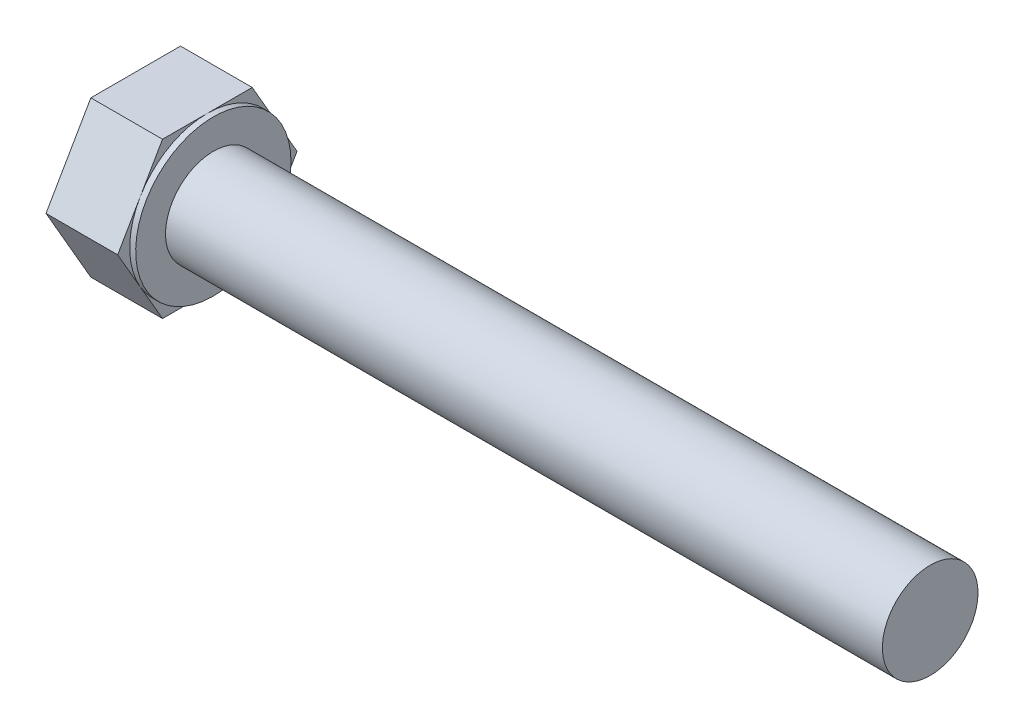
ISO-10303-21;
HEADER;
FILE_DESCRIPTION(('STEP AP214'),'2;1');
FILE_NAME('part.step','',(''),(''),'','','');
FILE_SCHEMA(('AUTOMOTIVE_DESIGN { 1 0 10303 214 1 1 1 1 }'));
ENDSEC;
DATA;
#1=APPLICATION_CONTEXT('core data for automotive mechanical design processes');
#2=APPLICATION_PROTOCOL_DEFINITION('international standard','automotive_design',2000,#1);
#3=PRODUCT_CONTEXT('',#1,'mechanical');
#4=PRODUCT('Part','Part','',(#3));
#5=PRODUCT_RELATED_PRODUCT_CATEGORY('part','',(#4));
#6=PRODUCT_DEFINITION_FORMATION('','',#4);
#7=PRODUCT_DEFINITION_CONTEXT('part definition',#1,'design');
#8=PRODUCT_DEFINITION('design','',#6,#7);
#9=PRODUCT_DEFINITION_SHAPE('','',#8);
#10=(LENGTH_UNIT() NAMED_UNIT(*) SI_UNIT(.MILLI.,.METRE.));
#11=(NAMED_UNIT(*) PLANE_ANGLE_UNIT() SI_UNIT($,.RADIAN.));
#12=(NAMED_UNIT(*) SI_UNIT($,.STERADIAN.) SOLID_ANGLE_UNIT());
#13=UNCERTAINTY_MEASURE_WITH_UNIT(LENGTH_MEASURE(1.E-05),#10,'distance_accuracy_value','');
#14=(GEOMETRIC_REPRESENTATION_CONTEXT(3) GLOBAL_UNCERTAINTY_ASSIGNED_CONTEXT((#13)) GLOBAL_UNIT_ASSIGNED_CONTEXT((#10,
#11,#12)) REPRESENTATION_CONTEXT('',''));
#15=CARTESIAN_POINT('',(0.,0.,0.));
#16=DIRECTION('',(0.,0.,1.));
#17=DIRECTION('',(1.,0.,0.));
#18=AXIS2_PLACEMENT_3D('',#15,#16,#17);
#19=CARTESIAN_POINT('',(0.5,0.,0.));
#20=DIRECTION('',(1.,0.,0.));
#21=DIRECTION('',(0.,0.,-1.));
#22=AXIS2_PLACEMENT_3D('',#19,#20,#21);
#23=PLANE('',#22);
#24=CARTESIAN_POINT('',(0.5,0.,0.));
#25=DIRECTION('',(1.,0.,0.));
#26=DIRECTION('',(0.,0.,-1.));
#27=AXIS2_PLACEMENT_3D('',#24,#25,#26);
#28=CIRCLE('',#27,6.50000000000004);
#29=CARTESIAN_POINT('',(0.5,0.,-6.50000000000004));
#30=VERTEX_POINT('',#29);
#31=EDGE_CURVE('E126',#30,#30,#28,.T.);
#32=ORIENTED_EDGE('',*,*,#31,.T.);
#33=EDGE_LOOP('',(#32));
#34=FACE_BOUND('',#33,.T.);
#35=CARTESIAN_POINT('',(0.5,0.,0.));
#36=DIRECTION('',(1.,0.,0.));
#37=DIRECTION('',(0.,0.,-1.));
#38=AXIS2_PLACEMENT_3D('',#35,#36,#37);
#39=CIRCLE('',#38,4.);
#40=CARTESIAN_POINT('',(0.5,0.,-4.));
#41=VERTEX_POINT('',#40);
#42=EDGE_CURVE('E349',#41,#41,#39,.T.);
#43=ORIENTED_EDGE('',*,*,#42,.F.);
#44=EDGE_LOOP('',(#43));
#45=FACE_BOUND('',#44,.T.);
#46=ADVANCED_FACE('F33',(#34,#45),#23,.T.);
#47=CARTESIAN_POINT('',(0.,0.,0.));
#48=DIRECTION('',(1.,0.,0.));
#49=DIRECTION('',(0.,0.,-1.));
#50=AXIS2_PLACEMENT_3D('',#47,#48,#49);
#51=PLANE('',#50);
#52=CARTESIAN_POINT('',(0.,0.,0.));
#53=DIRECTION('',(1.,0.,0.));
#54=DIRECTION('',(0.,0.,-1.));
#55=AXIS2_PLACEMENT_3D('',#52,#53,#54);
#56=CIRCLE('',#55,6.50000000000004);
#57=CARTESIAN_POINT('',(0.,3.25000000000007,-5.62916512459886));
#58=VERTEX_POINT('',#57);
#59=CARTESIAN_POINT('',(0.,6.5,0.));
#60=VERTEX_POINT('',#59);
#61=EDGE_CURVE('E44',#58,#60,#56,.T.);
#62=ORIENTED_EDGE('',*,*,#61,.F.);
#63=DIRECTION('',(0.,0.866025403784435,0.500000000000007));
#64=VECTOR('',#63,1.);
#65=CARTESIAN_POINT('',(0.,0.,-7.50555349946514));
#66=LINE('',#65,#64);
#67=CARTESIAN_POINT('',(0.,6.50000000000004,-3.75277674973251));
#68=VERTEX_POINT('',#67);
#69=EDGE_CURVE('E111',#58,#68,#66,.T.);
#70=ORIENTED_EDGE('',*,*,#69,.T.);
#71=DIRECTION('',(0.,0.,1.));
#72=VECTOR('',#71,1.);
#73=CARTESIAN_POINT('',(0.,6.50000000000004,-3.75277674973251));
#74=LINE('',#73,#72);
#75=EDGE_CURVE('E124',#68,#60,#74,.T.);
#76=ORIENTED_EDGE('',*,*,#75,.T.);
#77=EDGE_LOOP('',(#62,#70,#76));
#78=FACE_BOUND('',#77,.T.);
#79=ADVANCED_FACE('F123',(#78),#51,.T.);
#80=CARTESIAN_POINT('',(0.,3.24999999999998,5.62916512459889));
#81=VERTEX_POINT('',#80);
#82=EDGE_CURVE('E11',#60,#81,#56,.T.);
#83=ORIENTED_EDGE('',*,*,#82,.F.);
#84=CARTESIAN_POINT('',(0.,6.49999999999996,3.75277674973265));
#85=VERTEX_POINT('',#84);
#86=EDGE_CURVE('E110',#60,#85,#74,.T.);
#87=ORIENTED_EDGE('',*,*,#86,.T.);
#88=DIRECTION('',(0.,-0.866025403784442,0.499999999999995));
#89=VECTOR('',#88,1.);
#90=CARTESIAN_POINT('',(0.,6.49999999999996,3.75277674973265));
#91=LINE('',#90,#89);
#92=EDGE_CURVE('E156',#85,#81,#91,.T.);
#93=ORIENTED_EDGE('',*,*,#92,.T.);
#94=EDGE_LOOP('',(#83,#87,#93));
#95=FACE_BOUND('',#94,.T.);
#96=ADVANCED_FACE('F209',(#95),#51,.T.);
#97=CARTESIAN_POINT('',(0.,-3.25000000000001,5.62916512459885));
#98=VERTEX_POINT('',#97);
#99=EDGE_CURVE('E42',#81,#98,#56,.T.);
#100=ORIENTED_EDGE('',*,*,#99,.F.);
#101=CARTESIAN_POINT('',(0.,0.,7.50555349946514));
#102=VERTEX_POINT('',#101);
#103=EDGE_CURVE('E159',#81,#102,#91,.T.);
#104=ORIENTED_EDGE('',*,*,#103,.T.);
#105=DIRECTION('',(0.,-0.866025403784438,-0.500000000000001));
#106=VECTOR('',#105,1.);
#107=CARTESIAN_POINT('',(0.,0.,7.50555349946514));
#108=LINE('',#107,#106);
#109=EDGE_CURVE('E160',#102,#98,#108,.T.);
#110=ORIENTED_EDGE('',*,*,#109,.T.);
#111=EDGE_LOOP('',(#100,#104,#110));
#112=FACE_BOUND('',#111,.T.);
#113=ADVANCED_FACE('F190',(#112),#51,.T.);
#114=CARTESIAN_POINT('',(0.,-6.5,0.));
#115=VERTEX_POINT('',#114);
#116=EDGE_CURVE('E133',#98,#115,#56,.T.);
#117=ORIENTED_EDGE('',*,*,#116,.F.);
#118=CARTESIAN_POINT('',(0.,-6.50000000000001,3.75277674973255));
#119=VERTEX_POINT('',#118);
#120=EDGE_CURVE('E158',#98,#119,#108,.T.);
#121=ORIENTED_EDGE('',*,*,#120,.T.);
#122=DIRECTION('',(0.,0.,-1.));
#123=VECTOR('',#122,1.);
#124=CARTESIAN_POINT('',(0.,-6.50000000000001,3.75277674973255));
#125=LINE('',#124,#123);
#126=EDGE_CURVE('E164',#119,#115,#125,.T.);
#127=ORIENTED_EDGE('',*,*,#126,.T.);
#128=EDGE_LOOP('',(#117,#121,#127));
#129=FACE_BOUND('',#128,.T.);
#130=ADVANCED_FACE('F192',(#129),#51,.T.);
#131=CARTESIAN_POINT('',(0.,-3.24999999999997,-5.62916512459887));
#132=VERTEX_POINT('',#131);
#133=EDGE_CURVE('E131',#115,#132,#56,.T.);
#134=ORIENTED_EDGE('',*,*,#133,.F.);
#135=CARTESIAN_POINT('',(0.,-6.49999999999999,-3.7527767497326));
#136=VERTEX_POINT('',#135);
#137=EDGE_CURVE('E163',#115,#136,#125,.T.);
#138=ORIENTED_EDGE('',*,*,#137,.T.);
#139=DIRECTION('',(0.,0.866025403784442,-0.499999999999995));
#140=VECTOR('',#139,1.);
#141=CARTESIAN_POINT('',(0.,-6.49999999999999,-3.7527767497326));
#142=LINE('',#141,#140);
#143=EDGE_CURVE('E121',#136,#132,#142,.T.);
#144=ORIENTED_EDGE('',*,*,#143,.T.);
#145=EDGE_LOOP('',(#134,#138,#144));
#146=FACE_BOUND('',#145,.T.);
#147=ADVANCED_FACE('F199',(#146),#51,.T.);
#148=CARTESIAN_POINT('',(-6.,6.49999999999996,3.75277674973265));
#149=DIRECTION('',(0.,0.499999999999995,0.866025403784441));
#150=DIRECTION('',(0.,-0.866025403784442,0.499999999999995));
#151=AXIS2_PLACEMENT_3D('',#148,#149,#150);
#152=PLANE('',#151);
#153=ORIENTED_EDGE('',*,*,#92,.F.);
#154=DIRECTION('',(1.,0.,0.));
#155=VECTOR('',#154,1.);
#156=CARTESIAN_POINT('',(-6.,6.49999999999996,3.75277674973265));
#157=LINE('',#156,#155);
#158=CARTESIAN_POINT('',(-6.,6.49999999999996,3.75277674973265));
#159=VERTEX_POINT('',#158);
#160=EDGE_CURVE('E132',#159,#85,#157,.T.);
#161=ORIENTED_EDGE('',*,*,#160,.F.);
#162=DIRECTION('',(0.,-0.866025403784442,0.499999999999995));
#163=VECTOR('',#162,1.);
#164=CARTESIAN_POINT('',(-6.,6.49999999999996,3.75277674973265));
#165=LINE('',#164,#163);
#166=CARTESIAN_POINT('',(-6.,0.,7.50555349946514));
#167=VERTEX_POINT('',#166);
#168=EDGE_CURVE('E139',#159,#167,#165,.T.);
#169=ORIENTED_EDGE('',*,*,#168,.T.);
#170=DIRECTION('',(1.,0.,0.));
#171=VECTOR('',#170,1.);
#172=CARTESIAN_POINT('',(-6.,0.,7.50555349946514));
#173=LINE('',#172,#171);
#174=EDGE_CURVE('E37',#167,#102,#173,.T.);
#175=ORIENTED_EDGE('',*,*,#174,.T.);
#176=ORIENTED_EDGE('',*,*,#103,.F.);
#177=EDGE_LOOP('',(#153,#161,#169,#175,#176));
#178=FACE_BOUND('',#177,.T.);
#179=ADVANCED_FACE('F35',(#178),#152,.T.);
#180=CARTESIAN_POINT('',(-6.,6.50000000000004,-3.75277674973251));
#181=DIRECTION('',(0.,1.,0.));
#182=DIRECTION('',(0.,0.,1.));
#183=AXIS2_PLACEMENT_3D('',#180,#181,#182);
#184=PLANE('',#183);
#185=ORIENTED_EDGE('',*,*,#75,.F.);
#186=DIRECTION('',(1.,0.,0.));
#187=VECTOR('',#186,1.);
#188=CARTESIAN_POINT('',(-6.,6.50000000000004,-3.75277674973251));
#189=LINE('',#188,#187);
#190=CARTESIAN_POINT('',(-6.,6.50000000000004,-3.75277674973251));
#191=VERTEX_POINT('',#190);
#192=EDGE_CURVE('E117',#191,#68,#189,.T.);
#193=ORIENTED_EDGE('',*,*,#192,.F.);
#194=DIRECTION('',(0.,0.,1.));
#195=VECTOR('',#194,1.);
#196=CARTESIAN_POINT('',(-6.,6.50000000000004,-3.75277674973251));
#197=LINE('',#196,#195);
#198=EDGE_CURVE('E153',#191,#159,#197,.T.);
#199=ORIENTED_EDGE('',*,*,#198,.T.);
#200=ORIENTED_EDGE('',*,*,#160,.T.);
#201=ORIENTED_EDGE('',*,*,#86,.F.);
#202=EDGE_LOOP('',(#185,#193,#199,#200,#201));
#203=FACE_BOUND('',#202,.T.);
#204=ADVANCED_FACE('F208',(#203),#184,.T.);
#205=CARTESIAN_POINT('',(-6.,0.,-7.50555349946514));
#206=DIRECTION('',(0.,0.500000000000007,-0.866025403784435));
#207=DIRECTION('',(0.,0.866025403784434,0.500000000000007));
#208=AXIS2_PLACEMENT_3D('',#205,#206,#207);
#209=PLANE('',#208);
#210=CARTESIAN_POINT('',(0.,0.,-7.50555349946514));
#211=VERTEX_POINT('',#210);
#212=EDGE_CURVE('E104',#211,#58,#66,.T.);
#213=ORIENTED_EDGE('',*,*,#212,.F.);
#214=DIRECTION('',(1.,0.,0.));
#215=VECTOR('',#214,1.);
#216=CARTESIAN_POINT('',(-6.,0.,-7.50555349946514));
#217=LINE('',#216,#215);
#218=CARTESIAN_POINT('',(-6.,0.,-7.50555349946514));
#219=VERTEX_POINT('',#218);
#220=EDGE_CURVE('E171',#219,#211,#217,.T.);
#221=ORIENTED_EDGE('',*,*,#220,.F.);
#222=DIRECTION('',(0.,0.866025403784435,0.500000000000007));
#223=VECTOR('',#222,1.);
#224=CARTESIAN_POINT('',(-6.,0.,-7.50555349946514));
#225=LINE('',#224,#223);
#226=EDGE_CURVE('E151',#219,#191,#225,.T.);
#227=ORIENTED_EDGE('',*,*,#226,.T.);
#228=ORIENTED_EDGE('',*,*,#192,.T.);
#229=ORIENTED_EDGE('',*,*,#69,.F.);
#230=EDGE_LOOP('',(#213,#221,#227,#228,#229));
#231=FACE_BOUND('',#230,.T.);
#232=ADVANCED_FACE('F115',(#231),#209,.T.);
#233=CARTESIAN_POINT('',(-6.,-6.49999999999999,-3.7527767497326));
#234=DIRECTION('',(0.,-0.499999999999995,-0.866025403784441));
#235=DIRECTION('',(0.,0.866025403784442,-0.499999999999995));
#236=AXIS2_PLACEMENT_3D('',#233,#234,#235);
#237=PLANE('',#236);
#238=ORIENTED_EDGE('',*,*,#143,.F.);
#239=DIRECTION('',(1.,0.,0.));
#240=VECTOR('',#239,1.);
#241=CARTESIAN_POINT('',(-6.,-6.49999999999999,-3.7527767497326));
#242=LINE('',#241,#240);
#243=CARTESIAN_POINT('',(-6.,-6.49999999999999,-3.7527767497326));
#244=VERTEX_POINT('',#243);
#245=EDGE_CURVE('E173',#244,#136,#242,.T.);
#246=ORIENTED_EDGE('',*,*,#245,.F.);
#247=DIRECTION('',(0.,0.866025403784442,-0.499999999999995));
#248=VECTOR('',#247,1.);
#249=CARTESIAN_POINT('',(-6.,-6.49999999999999,-3.7527767497326));
#250=LINE('',#249,#248);
#251=EDGE_CURVE('E148',#244,#219,#250,.T.);
#252=ORIENTED_EDGE('',*,*,#251,.T.);
#253=ORIENTED_EDGE('',*,*,#220,.T.);
#254=EDGE_CURVE('E107',#132,#211,#142,.T.);
#255=ORIENTED_EDGE('',*,*,#254,.F.);
#256=EDGE_LOOP('',(#238,#246,#252,#253,#255));
#257=FACE_BOUND('',#256,.T.);
#258=ADVANCED_FACE('F201',(#257),#237,.T.);
#259=CARTESIAN_POINT('',(-6.,-6.50000000000001,3.75277674973255));
#260=DIRECTION('',(0.,-1.,0.));
#261=DIRECTION('',(0.,0.,-1.));
#262=AXIS2_PLACEMENT_3D('',#259,#260,#261);
#263=PLANE('',#262);
#264=ORIENTED_EDGE('',*,*,#126,.F.);
#265=DIRECTION('',(1.,0.,0.));
#266=VECTOR('',#265,1.);
#267=CARTESIAN_POINT('',(-6.,-6.50000000000001,3.75277674973255));
#268=LINE('',#267,#266);
#269=CARTESIAN_POINT('',(-6.,-6.50000000000001,3.75277674973255));
#270=VERTEX_POINT('',#269);
#271=EDGE_CURVE('E175',#270,#119,#268,.T.);
#272=ORIENTED_EDGE('',*,*,#271,.F.);
#273=DIRECTION('',(0.,0.,-1.));
#274=VECTOR('',#273,1.);
#275=CARTESIAN_POINT('',(-6.,-6.50000000000001,3.75277674973255));
#276=LINE('',#275,#274);
#277=EDGE_CURVE('E145',#270,#244,#276,.T.);
#278=ORIENTED_EDGE('',*,*,#277,.T.);
#279=ORIENTED_EDGE('',*,*,#245,.T.);
#280=ORIENTED_EDGE('',*,*,#137,.F.);
#281=EDGE_LOOP('',(#264,#272,#278,#279,#280));
#282=FACE_BOUND('',#281,.T.);
#283=ADVANCED_FACE('F195',(#282),#263,.T.);
#284=CARTESIAN_POINT('',(-6.,0.,7.50555349946514));
#285=DIRECTION('',(0.,-0.500000000000001,0.866025403784438));
#286=DIRECTION('',(0.,-0.866025403784438,-0.500000000000001));
#287=AXIS2_PLACEMENT_3D('',#284,#285,#286);
#288=PLANE('',#287);
#289=ORIENTED_EDGE('',*,*,#109,.F.);
#290=ORIENTED_EDGE('',*,*,#174,.F.);
#291=DIRECTION('',(0.,-0.866025403784438,-0.500000000000001));
#292=VECTOR('',#291,1.);
#293=CARTESIAN_POINT('',(-6.,0.,7.50555349946514));
#294=LINE('',#293,#292);
#295=EDGE_CURVE('E142',#167,#270,#294,.T.);
#296=ORIENTED_EDGE('',*,*,#295,.T.);
#297=ORIENTED_EDGE('',*,*,#271,.T.);
#298=ORIENTED_EDGE('',*,*,#120,.F.);
#299=EDGE_LOOP('',(#289,#290,#296,#297,#298));
#300=FACE_BOUND('',#299,.T.);
#301=ADVANCED_FACE('F187',(#300),#288,.T.);
#302=CARTESIAN_POINT('',(-6.,0.,0.));
#303=DIRECTION('',(1.,0.,0.));
#304=DIRECTION('',(0.,0.,-1.));
#305=AXIS2_PLACEMENT_3D('',#302,#303,#304);
#306=PLANE('',#305);
#307=ORIENTED_EDGE('',*,*,#168,.F.);
#308=ORIENTED_EDGE('',*,*,#198,.F.);
#309=ORIENTED_EDGE('',*,*,#226,.F.);
#310=ORIENTED_EDGE('',*,*,#251,.F.);
#311=ORIENTED_EDGE('',*,*,#277,.F.);
#312=ORIENTED_EDGE('',*,*,#295,.F.);
#313=EDGE_LOOP('',(#307,#308,#309,#310,#311,#312));
#314=FACE_BOUND('',#313,.T.);
#315=ADVANCED_FACE('F206',(#314),#306,.F.);
#316=EDGE_CURVE('E57',#132,#58,#56,.T.);
#317=ORIENTED_EDGE('',*,*,#316,.F.);
#318=ORIENTED_EDGE('',*,*,#254,.T.);
#319=ORIENTED_EDGE('',*,*,#212,.T.);
#320=EDGE_LOOP('',(#317,#318,#319));
#321=FACE_BOUND('',#320,.T.);
#322=ADVANCED_FACE('F106',(#321),#51,.T.);
#323=CARTESIAN_POINT('',(0.5,0.,0.));
#324=DIRECTION('',(-1.,0.,0.));
#325=DIRECTION('',(0.,0.,1.));
#326=AXIS2_PLACEMENT_3D('',#323,#324,#325);
#327=CYLINDRICAL_SURFACE('',#326,6.50000000000004);
#328=ORIENTED_EDGE('',*,*,#31,.F.);
#329=EDGE_LOOP('',(#328));
#330=FACE_BOUND('',#329,.T.);
#331=ORIENTED_EDGE('',*,*,#61,.T.);
#332=ORIENTED_EDGE('',*,*,#82,.T.);
#333=ORIENTED_EDGE('',*,*,#99,.T.);
#334=ORIENTED_EDGE('',*,*,#116,.T.);
#335=ORIENTED_EDGE('',*,*,#133,.T.);
#336=ORIENTED_EDGE('',*,*,#316,.T.);
#337=EDGE_LOOP('',(#331,#332,#333,#334,#335,#336));
#338=FACE_BOUND('',#337,.T.);
#339=ADVANCED_FACE('F129',(#330,#338),#327,.T.);
#340=CARTESIAN_POINT('',(60.5,0.,0.));
#341=DIRECTION('',(-1.,0.,0.));
#342=DIRECTION('',(0.,0.,1.));
#343=AXIS2_PLACEMENT_3D('',#340,#341,#342);
#344=CYLINDRICAL_SURFACE('',#343,4.);
#345=CARTESIAN_POINT('',(60.5,0.,0.));
#346=DIRECTION('',(1.,0.,0.));
#347=DIRECTION('',(0.,0.,-1.));
#348=AXIS2_PLACEMENT_3D('',#345,#346,#347);
#349=CIRCLE('',#348,4.);
#350=CARTESIAN_POINT('',(60.5,0.,-4.));
#351=VERTEX_POINT('',#350);
#352=EDGE_CURVE('E127',#351,#351,#349,.T.);
#353=ORIENTED_EDGE('',*,*,#352,.F.);
#354=EDGE_LOOP('',(#353));
#355=FACE_BOUND('',#354,.T.);
#356=ORIENTED_EDGE('',*,*,#42,.T.);
#357=EDGE_LOOP('',(#356));
#358=FACE_BOUND('',#357,.T.);
#359=ADVANCED_FACE('F227',(#355,#358),#344,.T.);
#360=CARTESIAN_POINT('',(60.5,0.,0.));
#361=DIRECTION('',(1.,0.,0.));
#362=DIRECTION('',(0.,0.,-1.));
#363=AXIS2_PLACEMENT_3D('',#360,#361,#362);
#364=PLANE('',#363);
#365=ORIENTED_EDGE('',*,*,#352,.T.);
#366=EDGE_LOOP('',(#365));
#367=FACE_BOUND('',#366,.T.);
#368=ADVANCED_FACE('F335',(#367),#364,.T.);
#369=CLOSED_SHELL('',(#46,#79,#96,#113,#130,#147,#179,#204,#232,#258,#283,#301,#315,#322,#339,
#359,#368));
#370=MANIFOLD_SOLID_BREP('B2',#369);
#371=ADVANCED_BREP_SHAPE_REPRESENTATION('',(#18,#370),#14);
#372=SHAPE_DEFINITION_REPRESENTATION(#9,#371);
ENDSEC;
END-ISO-10303-21;
